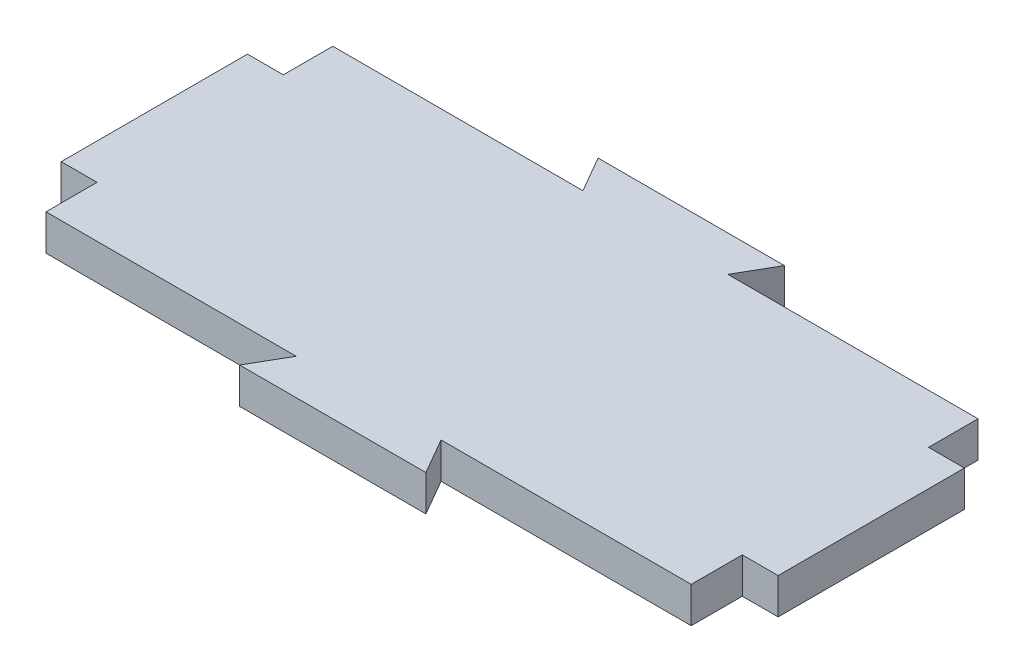
ISO-10303-21;
HEADER;
FILE_DESCRIPTION(('STEP AP214'),'2;1');
FILE_NAME('part.step','',(''),(''),'','','');
FILE_SCHEMA(('AUTOMOTIVE_DESIGN { 1 0 10303 214 1 1 1 1 }'));
ENDSEC;
DATA;
#1=APPLICATION_CONTEXT('core data for automotive mechanical design processes');
#2=APPLICATION_PROTOCOL_DEFINITION('international standard','automotive_design',2000,#1);
#3=PRODUCT_CONTEXT('',#1,'mechanical');
#4=PRODUCT('Part','Part','',(#3));
#5=PRODUCT_RELATED_PRODUCT_CATEGORY('part','',(#4));
#6=PRODUCT_DEFINITION_FORMATION('','',#4);
#7=PRODUCT_DEFINITION_CONTEXT('part definition',#1,'design');
#8=PRODUCT_DEFINITION('design','',#6,#7);
#9=PRODUCT_DEFINITION_SHAPE('','',#8);
#10=(LENGTH_UNIT() NAMED_UNIT(*) SI_UNIT(.MILLI.,.METRE.));
#11=(NAMED_UNIT(*) PLANE_ANGLE_UNIT() SI_UNIT($,.RADIAN.));
#12=(NAMED_UNIT(*) SI_UNIT($,.STERADIAN.) SOLID_ANGLE_UNIT());
#13=UNCERTAINTY_MEASURE_WITH_UNIT(LENGTH_MEASURE(1.E-05),#10,'distance_accuracy_value','');
#14=(GEOMETRIC_REPRESENTATION_CONTEXT(3) GLOBAL_UNCERTAINTY_ASSIGNED_CONTEXT((#13)) GLOBAL_UNIT_ASSIGNED_CONTEXT((#10,
#11,#12)) REPRESENTATION_CONTEXT('',''));
#15=CARTESIAN_POINT('',(0.,0.,0.));
#16=DIRECTION('',(0.,0.,1.));
#17=DIRECTION('',(1.,0.,0.));
#18=AXIS2_PLACEMENT_3D('',#15,#16,#17);
#19=CARTESIAN_POINT('',(0.,5.,-20.));
#20=DIRECTION('',(0.,0.,1.));
#21=DIRECTION('',(1.,0.,0.));
#22=AXIS2_PLACEMENT_3D('',#19,#20,#21);
#23=PLANE('',#22);
#24=DIRECTION('',(-1.,0.,0.));
#25=VECTOR('',#24,1.);
#26=CARTESIAN_POINT('',(0.,0.,-20.));
#27=LINE('',#26,#25);
#28=CARTESIAN_POINT('',(-10.1036297108184,0.,-20.));
#29=VERTEX_POINT('',#28);
#30=CARTESIAN_POINT('',(-45.,0.,-20.));
#31=VERTEX_POINT('',#30);
#32=EDGE_CURVE('E395',#29,#31,#27,.T.);
#33=ORIENTED_EDGE('',*,*,#32,.T.);
#34=DIRECTION('',(0.,-1.,0.));
#35=VECTOR('',#34,1.);
#36=CARTESIAN_POINT('',(-45.,5.,-20.));
#37=LINE('',#36,#35);
#38=CARTESIAN_POINT('',(-45.,5.,-20.));
#39=VERTEX_POINT('',#38);
#40=EDGE_CURVE('E419',#39,#31,#37,.T.);
#41=ORIENTED_EDGE('',*,*,#40,.F.);
#42=DIRECTION('',(-1.,0.,0.));
#43=VECTOR('',#42,1.);
#44=CARTESIAN_POINT('',(0.,5.,-20.));
#45=LINE('',#44,#43);
#46=CARTESIAN_POINT('',(-10.1036297108184,5.,-20.));
#47=VERTEX_POINT('',#46);
#48=EDGE_CURVE('E470',#47,#39,#45,.T.);
#49=ORIENTED_EDGE('',*,*,#48,.F.);
#50=DIRECTION('',(0.,-1.,0.));
#51=VECTOR('',#50,1.);
#52=CARTESIAN_POINT('',(-10.1036297108184,5.,-20.));
#53=LINE('',#52,#51);
#54=EDGE_CURVE('E421',#47,#29,#53,.T.);
#55=ORIENTED_EDGE('',*,*,#54,.T.);
#56=EDGE_LOOP('',(#33,#41,#49,#55));
#57=FACE_BOUND('',#56,.T.);
#58=ADVANCED_FACE('F201',(#57),#23,.F.);
#59=CARTESIAN_POINT('',(-45.,5.,0.));
#60=DIRECTION('',(1.,0.,0.));
#61=DIRECTION('',(0.,0.,-1.));
#62=AXIS2_PLACEMENT_3D('',#59,#60,#61);
#63=PLANE('',#62);
#64=DIRECTION('',(0.,-1.,0.));
#65=VECTOR('',#64,1.);
#66=CARTESIAN_POINT('',(-45.,5.,-13.103802672148));
#67=LINE('',#66,#65);
#68=CARTESIAN_POINT('',(-45.,5.,-13.103802672148));
#69=VERTEX_POINT('',#68);
#70=CARTESIAN_POINT('',(-45.,0.,-13.103802672148));
#71=VERTEX_POINT('',#70);
#72=EDGE_CURVE('E12',#69,#71,#67,.T.);
#73=ORIENTED_EDGE('',*,*,#72,.F.);
#74=DIRECTION('',(0.,0.,1.));
#75=VECTOR('',#74,1.);
#76=CARTESIAN_POINT('',(-45.,5.,0.));
#77=LINE('',#76,#75);
#78=EDGE_CURVE('E456',#39,#69,#77,.T.);
#79=ORIENTED_EDGE('',*,*,#78,.F.);
#80=ORIENTED_EDGE('',*,*,#40,.T.);
#81=DIRECTION('',(0.,0.,1.));
#82=VECTOR('',#81,1.);
#83=CARTESIAN_POINT('',(-45.,0.,0.));
#84=LINE('',#83,#82);
#85=EDGE_CURVE('E391',#31,#71,#84,.T.);
#86=ORIENTED_EDGE('',*,*,#85,.T.);
#87=EDGE_LOOP('',(#73,#79,#80,#86));
#88=FACE_BOUND('',#87,.T.);
#89=ADVANCED_FACE('F455',(#88),#63,.F.);
#90=CARTESIAN_POINT('',(-45.,5.,12.8769594413852));
#91=VERTEX_POINT('',#90);
#92=CARTESIAN_POINT('',(-45.,5.,20.));
#93=VERTEX_POINT('',#92);
#94=EDGE_CURVE('E509',#91,#93,#77,.T.);
#95=ORIENTED_EDGE('',*,*,#94,.F.);
#96=DIRECTION('',(0.,-1.,0.));
#97=VECTOR('',#96,1.);
#98=CARTESIAN_POINT('',(-45.,5.,12.8769594413852));
#99=LINE('',#98,#97);
#100=CARTESIAN_POINT('',(-45.,0.,12.8769594413852));
#101=VERTEX_POINT('',#100);
#102=EDGE_CURVE('E213',#91,#101,#99,.T.);
#103=ORIENTED_EDGE('',*,*,#102,.T.);
#104=CARTESIAN_POINT('',(-45.,0.,20.));
#105=VERTEX_POINT('',#104);
#106=EDGE_CURVE('E396',#101,#105,#84,.T.);
#107=ORIENTED_EDGE('',*,*,#106,.T.);
#108=DIRECTION('',(0.,-1.,0.));
#109=VECTOR('',#108,1.);
#110=CARTESIAN_POINT('',(-45.,5.,20.));
#111=LINE('',#110,#109);
#112=EDGE_CURVE('E417',#93,#105,#111,.T.);
#113=ORIENTED_EDGE('',*,*,#112,.F.);
#114=EDGE_LOOP('',(#95,#103,#107,#113));
#115=FACE_BOUND('',#114,.T.);
#116=ADVANCED_FACE('F508',(#115),#63,.F.);
#117=CARTESIAN_POINT('',(0.,5.,20.));
#118=DIRECTION('',(0.,0.,1.));
#119=DIRECTION('',(1.,0.,0.));
#120=AXIS2_PLACEMENT_3D('',#117,#118,#119);
#121=PLANE('',#120);
#122=DIRECTION('',(-1.,0.,0.));
#123=VECTOR('',#122,1.);
#124=CARTESIAN_POINT('',(0.,0.,20.));
#125=LINE('',#124,#123);
#126=CARTESIAN_POINT('',(-10.1036297108184,0.,20.));
#127=VERTEX_POINT('',#126);
#128=EDGE_CURVE('E399',#127,#105,#125,.T.);
#129=ORIENTED_EDGE('',*,*,#128,.F.);
#130=DIRECTION('',(0.,-1.,0.));
#131=VECTOR('',#130,1.);
#132=CARTESIAN_POINT('',(-10.1036297108184,5.,20.));
#133=LINE('',#132,#131);
#134=CARTESIAN_POINT('',(-10.1036297108184,5.,20.));
#135=VERTEX_POINT('',#134);
#136=EDGE_CURVE('E411',#135,#127,#133,.T.);
#137=ORIENTED_EDGE('',*,*,#136,.F.);
#138=DIRECTION('',(-1.,0.,0.));
#139=VECTOR('',#138,1.);
#140=CARTESIAN_POINT('',(0.,5.,20.));
#141=LINE('',#140,#139);
#142=EDGE_CURVE('E389',#135,#93,#141,.T.);
#143=ORIENTED_EDGE('',*,*,#142,.T.);
#144=ORIENTED_EDGE('',*,*,#112,.T.);
#145=EDGE_LOOP('',(#129,#137,#143,#144));
#146=FACE_BOUND('',#145,.T.);
#147=ADVANCED_FACE('F534',(#146),#121,.T.);
#148=CARTESIAN_POINT('',(45.,0.,20.));
#149=VERTEX_POINT('',#148);
#150=CARTESIAN_POINT('',(10.1036297108185,0.,20.));
#151=VERTEX_POINT('',#150);
#152=EDGE_CURVE('E405',#149,#151,#125,.T.);
#153=ORIENTED_EDGE('',*,*,#152,.F.);
#154=DIRECTION('',(0.,-1.,0.));
#155=VECTOR('',#154,1.);
#156=CARTESIAN_POINT('',(45.,5.,20.));
#157=LINE('',#156,#155);
#158=CARTESIAN_POINT('',(45.,5.,20.));
#159=VERTEX_POINT('',#158);
#160=EDGE_CURVE('E410',#159,#149,#157,.T.);
#161=ORIENTED_EDGE('',*,*,#160,.F.);
#162=CARTESIAN_POINT('',(10.1036297108185,5.,20.));
#163=VERTEX_POINT('',#162);
#164=EDGE_CURVE('E381',#159,#163,#141,.T.);
#165=ORIENTED_EDGE('',*,*,#164,.T.);
#166=DIRECTION('',(0.,-1.,0.));
#167=VECTOR('',#166,1.);
#168=CARTESIAN_POINT('',(10.1036297108185,5.,20.));
#169=LINE('',#168,#167);
#170=EDGE_CURVE('E412',#163,#151,#169,.T.);
#171=ORIENTED_EDGE('',*,*,#170,.T.);
#172=EDGE_LOOP('',(#153,#161,#165,#171));
#173=FACE_BOUND('',#172,.T.);
#174=ADVANCED_FACE('F549',(#173),#121,.T.);
#175=CARTESIAN_POINT('',(45.,5.,0.));
#176=DIRECTION('',(1.,0.,0.));
#177=DIRECTION('',(0.,0.,-1.));
#178=AXIS2_PLACEMENT_3D('',#175,#176,#177);
#179=PLANE('',#178);
#180=DIRECTION('',(0.,-1.,0.));
#181=VECTOR('',#180,1.);
#182=CARTESIAN_POINT('',(45.,5.,12.8769594413852));
#183=LINE('',#182,#181);
#184=CARTESIAN_POINT('',(45.,5.,12.8769594413852));
#185=VERTEX_POINT('',#184);
#186=CARTESIAN_POINT('',(45.,0.,12.8769594413852));
#187=VERTEX_POINT('',#186);
#188=EDGE_CURVE('E225',#185,#187,#183,.T.);
#189=ORIENTED_EDGE('',*,*,#188,.F.);
#190=DIRECTION('',(0.,0.,1.));
#191=VECTOR('',#190,1.);
#192=CARTESIAN_POINT('',(45.,5.,0.));
#193=LINE('',#192,#191);
#194=EDGE_CURVE('E378',#185,#159,#193,.T.);
#195=ORIENTED_EDGE('',*,*,#194,.T.);
#196=ORIENTED_EDGE('',*,*,#160,.T.);
#197=DIRECTION('',(0.,0.,1.));
#198=VECTOR('',#197,1.);
#199=CARTESIAN_POINT('',(45.,0.,0.));
#200=LINE('',#199,#198);
#201=EDGE_CURVE('E408',#187,#149,#200,.T.);
#202=ORIENTED_EDGE('',*,*,#201,.F.);
#203=EDGE_LOOP('',(#189,#195,#196,#202));
#204=FACE_BOUND('',#203,.T.);
#205=ADVANCED_FACE('F555',(#204),#179,.T.);
#206=CARTESIAN_POINT('',(45.,5.,-20.));
#207=VERTEX_POINT('',#206);
#208=CARTESIAN_POINT('',(45.,5.,-13.103802672148));
#209=VERTEX_POINT('',#208);
#210=EDGE_CURVE('E383',#207,#209,#193,.T.);
#211=ORIENTED_EDGE('',*,*,#210,.T.);
#212=DIRECTION('',(0.,-1.,0.));
#213=VECTOR('',#212,1.);
#214=CARTESIAN_POINT('',(45.,5.,-13.103802672148));
#215=LINE('',#214,#213);
#216=CARTESIAN_POINT('',(45.,0.,-13.103802672148));
#217=VERTEX_POINT('',#216);
#218=EDGE_CURVE('E307',#209,#217,#215,.T.);
#219=ORIENTED_EDGE('',*,*,#218,.T.);
#220=CARTESIAN_POINT('',(45.,0.,-20.));
#221=VERTEX_POINT('',#220);
#222=EDGE_CURVE('E401',#221,#217,#200,.T.);
#223=ORIENTED_EDGE('',*,*,#222,.F.);
#224=DIRECTION('',(0.,-1.,0.));
#225=VECTOR('',#224,1.);
#226=CARTESIAN_POINT('',(45.,5.,-20.));
#227=LINE('',#226,#225);
#228=EDGE_CURVE('E390',#207,#221,#227,.T.);
#229=ORIENTED_EDGE('',*,*,#228,.F.);
#230=EDGE_LOOP('',(#211,#219,#223,#229));
#231=FACE_BOUND('',#230,.T.);
#232=ADVANCED_FACE('F551',(#231),#179,.T.);
#233=CARTESIAN_POINT('',(10.1036297108185,0.,-20.));
#234=VERTEX_POINT('',#233);
#235=EDGE_CURVE('E324',#221,#234,#27,.T.);
#236=ORIENTED_EDGE('',*,*,#235,.T.);
#237=DIRECTION('',(0.,-1.,0.));
#238=VECTOR('',#237,1.);
#239=CARTESIAN_POINT('',(10.1036297108185,5.,-20.));
#240=LINE('',#239,#238);
#241=CARTESIAN_POINT('',(10.1036297108185,5.,-20.));
#242=VERTEX_POINT('',#241);
#243=EDGE_CURVE('E309',#242,#234,#240,.T.);
#244=ORIENTED_EDGE('',*,*,#243,.F.);
#245=EDGE_CURVE('E403',#207,#242,#45,.T.);
#246=ORIENTED_EDGE('',*,*,#245,.F.);
#247=ORIENTED_EDGE('',*,*,#228,.T.);
#248=EDGE_LOOP('',(#236,#244,#246,#247));
#249=FACE_BOUND('',#248,.T.);
#250=ADVANCED_FACE('F516',(#249),#23,.F.);
#251=CARTESIAN_POINT('',(0.,0.,0.));
#252=DIRECTION('',(0.,1.,0.));
#253=DIRECTION('',(0.,0.,1.));
#254=AXIS2_PLACEMENT_3D('',#251,#252,#253);
#255=PLANE('',#254);
#256=DIRECTION('',(-0.5,0.,0.866025403784439));
#257=VECTOR('',#256,1.);
#258=CARTESIAN_POINT('',(0.,0.,2.49999999999999));
#259=LINE('',#258,#257);
#260=CARTESIAN_POINT('',(-12.9903810567666,0.,25.));
#261=VERTEX_POINT('',#260);
#262=EDGE_CURVE('E337',#127,#261,#259,.T.);
#263=ORIENTED_EDGE('',*,*,#262,.F.);
#264=ORIENTED_EDGE('',*,*,#128,.T.);
#265=ORIENTED_EDGE('',*,*,#106,.F.);
#266=DIRECTION('',(-1.,0.,0.));
#267=VECTOR('',#266,1.);
#268=CARTESIAN_POINT('',(-45.,0.,12.8769594413852));
#269=LINE('',#268,#267);
#270=CARTESIAN_POINT('',(-50.,0.,12.8769594413852));
#271=VERTEX_POINT('',#270);
#272=EDGE_CURVE('E348',#101,#271,#269,.T.);
#273=ORIENTED_EDGE('',*,*,#272,.T.);
#274=DIRECTION('',(0.,0.,-1.));
#275=VECTOR('',#274,1.);
#276=CARTESIAN_POINT('',(-50.,0.,12.8769594413852));
#277=LINE('',#276,#275);
#278=CARTESIAN_POINT('',(-50.,0.,-13.103802672148));
#279=VERTEX_POINT('',#278);
#280=EDGE_CURVE('E436',#271,#279,#277,.T.);
#281=ORIENTED_EDGE('',*,*,#280,.T.);
#282=DIRECTION('',(-1.,0.,0.));
#283=VECTOR('',#282,1.);
#284=CARTESIAN_POINT('',(-45.,0.,-13.103802672148));
#285=LINE('',#284,#283);
#286=EDGE_CURVE('E319',#71,#279,#285,.T.);
#287=ORIENTED_EDGE('',*,*,#286,.F.);
#288=ORIENTED_EDGE('',*,*,#85,.F.);
#289=ORIENTED_EDGE('',*,*,#32,.F.);
#290=DIRECTION('',(-0.5,0.,-0.866025403784439));
#291=VECTOR('',#290,1.);
#292=CARTESIAN_POINT('',(0.,0.,-2.49999999999999));
#293=LINE('',#292,#291);
#294=CARTESIAN_POINT('',(-12.9903810567666,0.,-25.));
#295=VERTEX_POINT('',#294);
#296=EDGE_CURVE('E361',#29,#295,#293,.T.);
#297=ORIENTED_EDGE('',*,*,#296,.T.);
#298=DIRECTION('',(1.,0.,0.));
#299=VECTOR('',#298,1.);
#300=CARTESIAN_POINT('',(-12.9903810567666,0.,-25.));
#301=LINE('',#300,#299);
#302=CARTESIAN_POINT('',(12.9903810567666,0.,-25.));
#303=VERTEX_POINT('',#302);
#304=EDGE_CURVE('E351',#295,#303,#301,.T.);
#305=ORIENTED_EDGE('',*,*,#304,.T.);
#306=DIRECTION('',(-0.5,0.,0.866025403784438));
#307=VECTOR('',#306,1.);
#308=CARTESIAN_POINT('',(12.9903810567666,0.,-25.));
#309=LINE('',#308,#307);
#310=EDGE_CURVE('E297',#303,#234,#309,.T.);
#311=ORIENTED_EDGE('',*,*,#310,.T.);
#312=ORIENTED_EDGE('',*,*,#235,.F.);
#313=ORIENTED_EDGE('',*,*,#222,.T.);
#314=DIRECTION('',(1.,0.,0.));
#315=VECTOR('',#314,1.);
#316=CARTESIAN_POINT('',(45.,0.,-13.103802672148));
#317=LINE('',#316,#315);
#318=CARTESIAN_POINT('',(50.,0.,-13.103802672148));
#319=VERTEX_POINT('',#318);
#320=EDGE_CURVE('E305',#217,#319,#317,.T.);
#321=ORIENTED_EDGE('',*,*,#320,.T.);
#322=DIRECTION('',(0.,0.,-1.));
#323=VECTOR('',#322,1.);
#324=CARTESIAN_POINT('',(50.,0.,12.8769594413852));
#325=LINE('',#324,#323);
#326=CARTESIAN_POINT('',(50.,0.,12.8769594413852));
#327=VERTEX_POINT('',#326);
#328=EDGE_CURVE('E295',#327,#319,#325,.T.);
#329=ORIENTED_EDGE('',*,*,#328,.F.);
#330=DIRECTION('',(1.,0.,0.));
#331=VECTOR('',#330,1.);
#332=CARTESIAN_POINT('',(45.,0.,12.8769594413852));
#333=LINE('',#332,#331);
#334=EDGE_CURVE('E284',#187,#327,#333,.T.);
#335=ORIENTED_EDGE('',*,*,#334,.F.);
#336=ORIENTED_EDGE('',*,*,#201,.T.);
#337=ORIENTED_EDGE('',*,*,#152,.T.);
#338=DIRECTION('',(-0.5,0.,-0.866025403784438));
#339=VECTOR('',#338,1.);
#340=CARTESIAN_POINT('',(12.9903810567666,0.,25.));
#341=LINE('',#340,#339);
#342=CARTESIAN_POINT('',(12.9903810567666,0.,25.));
#343=VERTEX_POINT('',#342);
#344=EDGE_CURVE('E335',#343,#151,#341,.T.);
#345=ORIENTED_EDGE('',*,*,#344,.F.);
#346=DIRECTION('',(1.,0.,0.));
#347=VECTOR('',#346,1.);
#348=CARTESIAN_POINT('',(-12.9903810567666,0.,25.));
#349=LINE('',#348,#347);
#350=EDGE_CURVE('E336',#261,#343,#349,.T.);
#351=ORIENTED_EDGE('',*,*,#350,.F.);
#352=EDGE_LOOP('',(#263,#264,#265,#273,#281,#287,#288,#289,#297,#305,#311,#312,#313,#321,#329,
#335,#336,#337,#345,#351));
#353=FACE_BOUND('',#352,.T.);
#354=ADVANCED_FACE('F296',(#353),#255,.F.);
#355=CARTESIAN_POINT('',(0.,5.,0.));
#356=DIRECTION('',(0.,1.,0.));
#357=DIRECTION('',(0.,0.,1.));
#358=AXIS2_PLACEMENT_3D('',#355,#356,#357);
#359=PLANE('',#358);
#360=ORIENTED_EDGE('',*,*,#142,.F.);
#361=DIRECTION('',(-0.5,0.,0.866025403784439));
#362=VECTOR('',#361,1.);
#363=CARTESIAN_POINT('',(0.,5.,2.49999999999999));
#364=LINE('',#363,#362);
#365=CARTESIAN_POINT('',(-12.9903810567666,5.,25.));
#366=VERTEX_POINT('',#365);
#367=EDGE_CURVE('E328',#135,#366,#364,.T.);
#368=ORIENTED_EDGE('',*,*,#367,.T.);
#369=DIRECTION('',(1.,0.,0.));
#370=VECTOR('',#369,1.);
#371=CARTESIAN_POINT('',(-12.9903810567666,5.,25.));
#372=LINE('',#371,#370);
#373=CARTESIAN_POINT('',(12.9903810567666,5.,25.));
#374=VERTEX_POINT('',#373);
#375=EDGE_CURVE('E332',#366,#374,#372,.T.);
#376=ORIENTED_EDGE('',*,*,#375,.T.);
#377=DIRECTION('',(-0.5,0.,-0.866025403784438));
#378=VECTOR('',#377,1.);
#379=CARTESIAN_POINT('',(12.9903810567666,5.,25.));
#380=LINE('',#379,#378);
#381=EDGE_CURVE('E331',#374,#163,#380,.T.);
#382=ORIENTED_EDGE('',*,*,#381,.T.);
#383=ORIENTED_EDGE('',*,*,#164,.F.);
#384=ORIENTED_EDGE('',*,*,#194,.F.);
#385=DIRECTION('',(1.,0.,0.));
#386=VECTOR('',#385,1.);
#387=CARTESIAN_POINT('',(45.,5.,12.8769594413852));
#388=LINE('',#387,#386);
#389=CARTESIAN_POINT('',(50.,5.,12.8769594413852));
#390=VERTEX_POINT('',#389);
#391=EDGE_CURVE('E371',#185,#390,#388,.T.);
#392=ORIENTED_EDGE('',*,*,#391,.T.);
#393=DIRECTION('',(0.,0.,-1.));
#394=VECTOR('',#393,1.);
#395=CARTESIAN_POINT('',(50.,5.,12.8769594413852));
#396=LINE('',#395,#394);
#397=CARTESIAN_POINT('',(50.,5.,-13.103802672148));
#398=VERTEX_POINT('',#397);
#399=EDGE_CURVE('E299',#390,#398,#396,.T.);
#400=ORIENTED_EDGE('',*,*,#399,.T.);
#401=DIRECTION('',(1.,0.,0.));
#402=VECTOR('',#401,1.);
#403=CARTESIAN_POINT('',(45.,5.,-13.103802672148));
#404=LINE('',#403,#402);
#405=EDGE_CURVE('E292',#209,#398,#404,.T.);
#406=ORIENTED_EDGE('',*,*,#405,.F.);
#407=ORIENTED_EDGE('',*,*,#210,.F.);
#408=ORIENTED_EDGE('',*,*,#245,.T.);
#409=DIRECTION('',(-0.5,0.,0.866025403784438));
#410=VECTOR('',#409,1.);
#411=CARTESIAN_POINT('',(12.9903810567666,5.,-25.));
#412=LINE('',#411,#410);
#413=CARTESIAN_POINT('',(12.9903810567666,5.,-25.));
#414=VERTEX_POINT('',#413);
#415=EDGE_CURVE('E353',#414,#242,#412,.T.);
#416=ORIENTED_EDGE('',*,*,#415,.F.);
#417=DIRECTION('',(1.,0.,0.));
#418=VECTOR('',#417,1.);
#419=CARTESIAN_POINT('',(-12.9903810567666,5.,-25.));
#420=LINE('',#419,#418);
#421=CARTESIAN_POINT('',(-12.9903810567666,5.,-25.));
#422=VERTEX_POINT('',#421);
#423=EDGE_CURVE('E360',#422,#414,#420,.T.);
#424=ORIENTED_EDGE('',*,*,#423,.F.);
#425=DIRECTION('',(-0.5,0.,-0.866025403784439));
#426=VECTOR('',#425,1.);
#427=CARTESIAN_POINT('',(0.,5.,-2.49999999999999));
#428=LINE('',#427,#426);
#429=EDGE_CURVE('E355',#47,#422,#428,.T.);
#430=ORIENTED_EDGE('',*,*,#429,.F.);
#431=ORIENTED_EDGE('',*,*,#48,.T.);
#432=ORIENTED_EDGE('',*,*,#78,.T.);
#433=DIRECTION('',(-1.,0.,0.));
#434=VECTOR('',#433,1.);
#435=CARTESIAN_POINT('',(-45.,5.,-13.103802672148));
#436=LINE('',#435,#434);
#437=CARTESIAN_POINT('',(-50.,5.,-13.103802672148));
#438=VERTEX_POINT('',#437);
#439=EDGE_CURVE('E327',#69,#438,#436,.T.);
#440=ORIENTED_EDGE('',*,*,#439,.T.);
#441=DIRECTION('',(0.,0.,-1.));
#442=VECTOR('',#441,1.);
#443=CARTESIAN_POINT('',(-50.,5.,12.8769594413852));
#444=LINE('',#443,#442);
#445=CARTESIAN_POINT('',(-50.,5.,12.8769594413852));
#446=VERTEX_POINT('',#445);
#447=EDGE_CURVE('E431',#446,#438,#444,.T.);
#448=ORIENTED_EDGE('',*,*,#447,.F.);
#449=DIRECTION('',(-1.,0.,0.));
#450=VECTOR('',#449,1.);
#451=CARTESIAN_POINT('',(-45.,5.,12.8769594413852));
#452=LINE('',#451,#450);
#453=EDGE_CURVE('E428',#91,#446,#452,.T.);
#454=ORIENTED_EDGE('',*,*,#453,.F.);
#455=ORIENTED_EDGE('',*,*,#94,.T.);
#456=EDGE_LOOP('',(#360,#368,#376,#382,#383,#384,#392,#400,#406,#407,#408,#416,#424,#430,#431,
#432,#440,#448,#454,#455));
#457=FACE_BOUND('',#456,.T.);
#458=ADVANCED_FACE('F374',(#457),#359,.T.);
#459=CARTESIAN_POINT('',(-12.9903810567666,5.,-25.));
#460=DIRECTION('',(0.,0.,-1.));
#461=DIRECTION('',(-1.,0.,0.));
#462=AXIS2_PLACEMENT_3D('',#459,#460,#461);
#463=PLANE('',#462);
#464=ORIENTED_EDGE('',*,*,#304,.F.);
#465=DIRECTION('',(0.,-1.,0.));
#466=VECTOR('',#465,1.);
#467=CARTESIAN_POINT('',(-12.9903810567666,5.,-25.));
#468=LINE('',#467,#466);
#469=EDGE_CURVE('E358',#422,#295,#468,.T.);
#470=ORIENTED_EDGE('',*,*,#469,.F.);
#471=ORIENTED_EDGE('',*,*,#423,.T.);
#472=DIRECTION('',(0.,-1.,0.));
#473=VECTOR('',#472,1.);
#474=CARTESIAN_POINT('',(12.9903810567666,5.,-25.));
#475=LINE('',#474,#473);
#476=EDGE_CURVE('E342',#414,#303,#475,.T.);
#477=ORIENTED_EDGE('',*,*,#476,.T.);
#478=EDGE_LOOP('',(#464,#470,#471,#477));
#479=FACE_BOUND('',#478,.T.);
#480=ADVANCED_FACE('F527',(#479),#463,.T.);
#481=CARTESIAN_POINT('',(0.,5.,-2.49999999999999));
#482=DIRECTION('',(-0.866025403784439,0.,0.5));
#483=DIRECTION('',(0.5,0.,0.866025403784439));
#484=AXIS2_PLACEMENT_3D('',#481,#482,#483);
#485=PLANE('',#484);
#486=ORIENTED_EDGE('',*,*,#54,.F.);
#487=ORIENTED_EDGE('',*,*,#429,.T.);
#488=ORIENTED_EDGE('',*,*,#469,.T.);
#489=ORIENTED_EDGE('',*,*,#296,.F.);
#490=EDGE_LOOP('',(#486,#487,#488,#489));
#491=FACE_BOUND('',#490,.T.);
#492=ADVANCED_FACE('F529',(#491),#485,.T.);
#493=CARTESIAN_POINT('',(12.9903810567666,5.,-25.));
#494=DIRECTION('',(0.866025403784439,0.,0.5));
#495=DIRECTION('',(0.5,0.,-0.866025403784439));
#496=AXIS2_PLACEMENT_3D('',#493,#494,#495);
#497=PLANE('',#496);
#498=ORIENTED_EDGE('',*,*,#415,.T.);
#499=ORIENTED_EDGE('',*,*,#243,.T.);
#500=ORIENTED_EDGE('',*,*,#310,.F.);
#501=ORIENTED_EDGE('',*,*,#476,.F.);
#502=EDGE_LOOP('',(#498,#499,#500,#501));
#503=FACE_BOUND('',#502,.T.);
#504=ADVANCED_FACE('F521',(#503),#497,.T.);
#505=CARTESIAN_POINT('',(0.,5.,2.49999999999999));
#506=DIRECTION('',(0.866025403784439,0.,0.5));
#507=DIRECTION('',(0.5,0.,-0.866025403784439));
#508=AXIS2_PLACEMENT_3D('',#505,#506,#507);
#509=PLANE('',#508);
#510=ORIENTED_EDGE('',*,*,#367,.F.);
#511=ORIENTED_EDGE('',*,*,#136,.T.);
#512=ORIENTED_EDGE('',*,*,#262,.T.);
#513=DIRECTION('',(0.,-1.,0.));
#514=VECTOR('',#513,1.);
#515=CARTESIAN_POINT('',(-12.9903810567666,5.,25.));
#516=LINE('',#515,#514);
#517=EDGE_CURVE('E350',#366,#261,#516,.T.);
#518=ORIENTED_EDGE('',*,*,#517,.F.);
#519=EDGE_LOOP('',(#510,#511,#512,#518));
#520=FACE_BOUND('',#519,.T.);
#521=ADVANCED_FACE('F539',(#520),#509,.F.);
#522=CARTESIAN_POINT('',(-12.9903810567666,5.,25.));
#523=DIRECTION('',(0.,0.,-1.));
#524=DIRECTION('',(-1.,0.,0.));
#525=AXIS2_PLACEMENT_3D('',#522,#523,#524);
#526=PLANE('',#525);
#527=ORIENTED_EDGE('',*,*,#350,.T.);
#528=DIRECTION('',(0.,-1.,0.));
#529=VECTOR('',#528,1.);
#530=CARTESIAN_POINT('',(12.9903810567666,5.,25.));
#531=LINE('',#530,#529);
#532=EDGE_CURVE('E339',#374,#343,#531,.T.);
#533=ORIENTED_EDGE('',*,*,#532,.F.);
#534=ORIENTED_EDGE('',*,*,#375,.F.);
#535=ORIENTED_EDGE('',*,*,#517,.T.);
#536=EDGE_LOOP('',(#527,#533,#534,#535));
#537=FACE_BOUND('',#536,.T.);
#538=ADVANCED_FACE('F542',(#537),#526,.F.);
#539=CARTESIAN_POINT('',(12.9903810567666,5.,25.));
#540=DIRECTION('',(-0.866025403784439,0.,0.5));
#541=DIRECTION('',(0.5,0.,0.866025403784439));
#542=AXIS2_PLACEMENT_3D('',#539,#540,#541);
#543=PLANE('',#542);
#544=ORIENTED_EDGE('',*,*,#170,.F.);
#545=ORIENTED_EDGE('',*,*,#381,.F.);
#546=ORIENTED_EDGE('',*,*,#532,.T.);
#547=ORIENTED_EDGE('',*,*,#344,.T.);
#548=EDGE_LOOP('',(#544,#545,#546,#547));
#549=FACE_BOUND('',#548,.T.);
#550=ADVANCED_FACE('F550',(#549),#543,.F.);
#551=CARTESIAN_POINT('',(50.,5.,12.8769594413852));
#552=DIRECTION('',(-1.,0.,0.));
#553=DIRECTION('',(0.,0.,1.));
#554=AXIS2_PLACEMENT_3D('',#551,#552,#553);
#555=PLANE('',#554);
#556=ORIENTED_EDGE('',*,*,#328,.T.);
#557=DIRECTION('',(0.,-1.,0.));
#558=VECTOR('',#557,1.);
#559=CARTESIAN_POINT('',(50.,5.,-13.103802672148));
#560=LINE('',#559,#558);
#561=EDGE_CURVE('E210',#398,#319,#560,.T.);
#562=ORIENTED_EDGE('',*,*,#561,.F.);
#563=ORIENTED_EDGE('',*,*,#399,.F.);
#564=DIRECTION('',(0.,-1.,0.));
#565=VECTOR('',#564,1.);
#566=CARTESIAN_POINT('',(50.,5.,12.8769594413852));
#567=LINE('',#566,#565);
#568=EDGE_CURVE('E281',#390,#327,#567,.T.);
#569=ORIENTED_EDGE('',*,*,#568,.T.);
#570=EDGE_LOOP('',(#556,#562,#563,#569));
#571=FACE_BOUND('',#570,.T.);
#572=ADVANCED_FACE('F293',(#571),#555,.F.);
#573=CARTESIAN_POINT('',(45.,5.,-13.103802672148));
#574=DIRECTION('',(0.,0.,-1.));
#575=DIRECTION('',(-1.,0.,0.));
#576=AXIS2_PLACEMENT_3D('',#573,#574,#575);
#577=PLANE('',#576);
#578=ORIENTED_EDGE('',*,*,#320,.F.);
#579=ORIENTED_EDGE('',*,*,#218,.F.);
#580=ORIENTED_EDGE('',*,*,#405,.T.);
#581=ORIENTED_EDGE('',*,*,#561,.T.);
#582=EDGE_LOOP('',(#578,#579,#580,#581));
#583=FACE_BOUND('',#582,.T.);
#584=ADVANCED_FACE('F202',(#583),#577,.T.);
#585=CARTESIAN_POINT('',(45.,5.,12.8769594413852));
#586=DIRECTION('',(0.,0.,-1.));
#587=DIRECTION('',(-1.,0.,0.));
#588=AXIS2_PLACEMENT_3D('',#585,#586,#587);
#589=PLANE('',#588);
#590=ORIENTED_EDGE('',*,*,#334,.T.);
#591=ORIENTED_EDGE('',*,*,#568,.F.);
#592=ORIENTED_EDGE('',*,*,#391,.F.);
#593=ORIENTED_EDGE('',*,*,#188,.T.);
#594=EDGE_LOOP('',(#590,#591,#592,#593));
#595=FACE_BOUND('',#594,.T.);
#596=ADVANCED_FACE('F285',(#595),#589,.F.);
#597=CARTESIAN_POINT('',(-50.,5.,12.8769594413852));
#598=DIRECTION('',(-1.,0.,0.));
#599=DIRECTION('',(0.,0.,1.));
#600=AXIS2_PLACEMENT_3D('',#597,#598,#599);
#601=PLANE('',#600);
#602=ORIENTED_EDGE('',*,*,#280,.F.);
#603=DIRECTION('',(0.,-1.,0.));
#604=VECTOR('',#603,1.);
#605=CARTESIAN_POINT('',(-50.,5.,12.8769594413852));
#606=LINE('',#605,#604);
#607=EDGE_CURVE('E326',#446,#271,#606,.T.);
#608=ORIENTED_EDGE('',*,*,#607,.F.);
#609=ORIENTED_EDGE('',*,*,#447,.T.);
#610=DIRECTION('',(0.,-1.,0.));
#611=VECTOR('',#610,1.);
#612=CARTESIAN_POINT('',(-50.,5.,-13.103802672148));
#613=LINE('',#612,#611);
#614=EDGE_CURVE('E323',#438,#279,#613,.T.);
#615=ORIENTED_EDGE('',*,*,#614,.T.);
#616=EDGE_LOOP('',(#602,#608,#609,#615));
#617=FACE_BOUND('',#616,.T.);
#618=ADVANCED_FACE('F580',(#617),#601,.T.);
#619=CARTESIAN_POINT('',(-45.,5.,12.8769594413852));
#620=DIRECTION('',(0.,0.,1.));
#621=DIRECTION('',(1.,0.,0.));
#622=AXIS2_PLACEMENT_3D('',#619,#620,#621);
#623=PLANE('',#622);
#624=ORIENTED_EDGE('',*,*,#272,.F.);
#625=ORIENTED_EDGE('',*,*,#102,.F.);
#626=ORIENTED_EDGE('',*,*,#453,.T.);
#627=ORIENTED_EDGE('',*,*,#607,.T.);
#628=EDGE_LOOP('',(#624,#625,#626,#627));
#629=FACE_BOUND('',#628,.T.);
#630=ADVANCED_FACE('F501',(#629),#623,.T.);
#631=CARTESIAN_POINT('',(-45.,5.,-13.103802672148));
#632=DIRECTION('',(0.,0.,1.));
#633=DIRECTION('',(1.,0.,0.));
#634=AXIS2_PLACEMENT_3D('',#631,#632,#633);
#635=PLANE('',#634);
#636=ORIENTED_EDGE('',*,*,#286,.T.);
#637=ORIENTED_EDGE('',*,*,#614,.F.);
#638=ORIENTED_EDGE('',*,*,#439,.F.);
#639=ORIENTED_EDGE('',*,*,#72,.T.);
#640=EDGE_LOOP('',(#636,#637,#638,#639));
#641=FACE_BOUND('',#640,.T.);
#642=ADVANCED_FACE('F444',(#641),#635,.F.);
#643=CLOSED_SHELL('',(#58,#89,#116,#147,#174,#205,#232,#250,#354,#458,#480,#492,#504,#521,#538,
#550,#572,#584,#596,#618,#630,#642));
#644=MANIFOLD_SOLID_BREP('B2',#643);
#645=ADVANCED_BREP_SHAPE_REPRESENTATION('',(#18,#644),#14);
#646=SHAPE_DEFINITION_REPRESENTATION(#9,#645);
ENDSEC;
END-ISO-10303-21;
